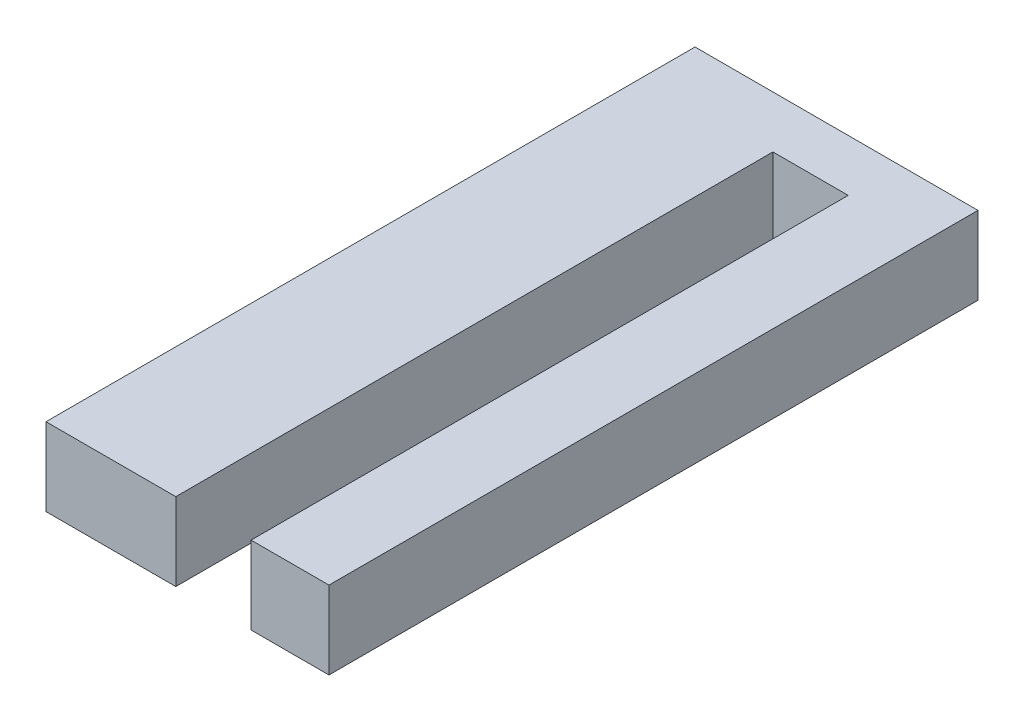
ISO-10303-21;
HEADER;
FILE_DESCRIPTION(('STEP AP214'),'2;1');
FILE_NAME('part.step','',(''),(''),'','','');
FILE_SCHEMA(('AUTOMOTIVE_DESIGN { 1 0 10303 214 1 1 1 1 }'));
ENDSEC;
DATA;
#1=APPLICATION_CONTEXT('core data for automotive mechanical design processes');
#2=APPLICATION_PROTOCOL_DEFINITION('international standard','automotive_design',2000,#1);
#3=PRODUCT_CONTEXT('',#1,'mechanical');
#4=PRODUCT('Part','Part','',(#3));
#5=PRODUCT_RELATED_PRODUCT_CATEGORY('part','',(#4));
#6=PRODUCT_DEFINITION_FORMATION('','',#4);
#7=PRODUCT_DEFINITION_CONTEXT('part definition',#1,'design');
#8=PRODUCT_DEFINITION('design','',#6,#7);
#9=PRODUCT_DEFINITION_SHAPE('','',#8);
#10=(LENGTH_UNIT() NAMED_UNIT(*) SI_UNIT(.MILLI.,.METRE.));
#11=(NAMED_UNIT(*) PLANE_ANGLE_UNIT() SI_UNIT($,.RADIAN.));
#12=(NAMED_UNIT(*) SI_UNIT($,.STERADIAN.) SOLID_ANGLE_UNIT());
#13=UNCERTAINTY_MEASURE_WITH_UNIT(LENGTH_MEASURE(1.E-05),#10,'distance_accuracy_value','');
#14=(GEOMETRIC_REPRESENTATION_CONTEXT(3) GLOBAL_UNCERTAINTY_ASSIGNED_CONTEXT((#13)) GLOBAL_UNIT_ASSIGNED_CONTEXT((#10,
#11,#12)) REPRESENTATION_CONTEXT('',''));
#15=CARTESIAN_POINT('',(0.,0.,0.));
#16=DIRECTION('',(0.,0.,1.));
#17=DIRECTION('',(1.,0.,0.));
#18=AXIS2_PLACEMENT_3D('',#15,#16,#17);
#19=CARTESIAN_POINT('',(5.,3.,0.));
#20=DIRECTION('',(0.,0.,-1.));
#21=DIRECTION('',(-1.,0.,0.));
#22=AXIS2_PLACEMENT_3D('',#19,#20,#21);
#23=PLANE('',#22);
#24=DIRECTION('',(1.,0.,0.));
#25=VECTOR('',#24,1.);
#26=CARTESIAN_POINT('',(5.,0.,0.));
#27=LINE('',#26,#25);
#28=CARTESIAN_POINT('',(0.,0.,0.));
#29=VERTEX_POINT('',#28);
#30=CARTESIAN_POINT('',(5.,0.,0.));
#31=VERTEX_POINT('',#30);
#32=EDGE_CURVE('E135',#29,#31,#27,.T.);
#33=ORIENTED_EDGE('',*,*,#32,.T.);
#34=DIRECTION('',(0.,-1.,0.));
#35=VECTOR('',#34,1.);
#36=CARTESIAN_POINT('',(5.,3.,0.));
#37=LINE('',#36,#35);
#38=CARTESIAN_POINT('',(5.,3.,0.));
#39=VERTEX_POINT('',#38);
#40=EDGE_CURVE('E11',#39,#31,#37,.T.);
#41=ORIENTED_EDGE('',*,*,#40,.F.);
#42=DIRECTION('',(1.,0.,0.));
#43=VECTOR('',#42,1.);
#44=CARTESIAN_POINT('',(5.,3.,0.));
#45=LINE('',#44,#43);
#46=CARTESIAN_POINT('',(0.,3.,0.));
#47=VERTEX_POINT('',#46);
#48=EDGE_CURVE('E149',#47,#39,#45,.T.);
#49=ORIENTED_EDGE('',*,*,#48,.F.);
#50=DIRECTION('',(0.,-1.,0.));
#51=VECTOR('',#50,1.);
#52=CARTESIAN_POINT('',(0.,3.,0.));
#53=LINE('',#52,#51);
#54=EDGE_CURVE('E131',#47,#29,#53,.T.);
#55=ORIENTED_EDGE('',*,*,#54,.T.);
#56=EDGE_LOOP('',(#33,#41,#49,#55));
#57=FACE_BOUND('',#56,.T.);
#58=ADVANCED_FACE('F39',(#57),#23,.F.);
#59=CARTESIAN_POINT('',(5.,3.,-23.));
#60=DIRECTION('',(-1.,0.,0.));
#61=DIRECTION('',(0.,0.,1.));
#62=AXIS2_PLACEMENT_3D('',#59,#60,#61);
#63=PLANE('',#62);
#64=DIRECTION('',(0.,0.,-1.));
#65=VECTOR('',#64,1.);
#66=CARTESIAN_POINT('',(5.,0.,-23.));
#67=LINE('',#66,#65);
#68=CARTESIAN_POINT('',(5.,0.,-23.));
#69=VERTEX_POINT('',#68);
#70=EDGE_CURVE('E138',#31,#69,#67,.T.);
#71=ORIENTED_EDGE('',*,*,#70,.T.);
#72=DIRECTION('',(0.,-1.,0.));
#73=VECTOR('',#72,1.);
#74=CARTESIAN_POINT('',(5.,3.,-23.));
#75=LINE('',#74,#73);
#76=CARTESIAN_POINT('',(5.,3.,-23.));
#77=VERTEX_POINT('',#76);
#78=EDGE_CURVE('E47',#77,#69,#75,.T.);
#79=ORIENTED_EDGE('',*,*,#78,.F.);
#80=DIRECTION('',(0.,0.,-1.));
#81=VECTOR('',#80,1.);
#82=CARTESIAN_POINT('',(5.,3.,-23.));
#83=LINE('',#82,#81);
#84=EDGE_CURVE('E98',#39,#77,#83,.T.);
#85=ORIENTED_EDGE('',*,*,#84,.F.);
#86=ORIENTED_EDGE('',*,*,#40,.T.);
#87=EDGE_LOOP('',(#71,#79,#85,#86));
#88=FACE_BOUND('',#87,.T.);
#89=ADVANCED_FACE('F184',(#88),#63,.F.);
#90=CARTESIAN_POINT('',(7.9,3.,-23.));
#91=DIRECTION('',(0.,0.,-1.));
#92=DIRECTION('',(-1.,0.,0.));
#93=AXIS2_PLACEMENT_3D('',#90,#91,#92);
#94=PLANE('',#93);
#95=DIRECTION('',(1.,0.,0.));
#96=VECTOR('',#95,1.);
#97=CARTESIAN_POINT('',(7.9,0.,-23.));
#98=LINE('',#97,#96);
#99=CARTESIAN_POINT('',(7.9,0.,-23.));
#100=VERTEX_POINT('',#99);
#101=EDGE_CURVE('E140',#69,#100,#98,.T.);
#102=ORIENTED_EDGE('',*,*,#101,.T.);
#103=DIRECTION('',(0.,-1.,0.));
#104=VECTOR('',#103,1.);
#105=CARTESIAN_POINT('',(7.9,3.,-23.));
#106=LINE('',#105,#104);
#107=CARTESIAN_POINT('',(7.9,3.,-23.));
#108=VERTEX_POINT('',#107);
#109=EDGE_CURVE('E156',#108,#100,#106,.T.);
#110=ORIENTED_EDGE('',*,*,#109,.F.);
#111=DIRECTION('',(1.,0.,0.));
#112=VECTOR('',#111,1.);
#113=CARTESIAN_POINT('',(7.9,3.,-23.));
#114=LINE('',#113,#112);
#115=EDGE_CURVE('E164',#77,#108,#114,.T.);
#116=ORIENTED_EDGE('',*,*,#115,.F.);
#117=ORIENTED_EDGE('',*,*,#78,.T.);
#118=EDGE_LOOP('',(#102,#110,#116,#117));
#119=FACE_BOUND('',#118,.T.);
#120=ADVANCED_FACE('F162',(#119),#94,.F.);
#121=CARTESIAN_POINT('',(7.9,3.,0.));
#122=DIRECTION('',(1.,0.,0.));
#123=DIRECTION('',(0.,0.,-1.));
#124=AXIS2_PLACEMENT_3D('',#121,#122,#123);
#125=PLANE('',#124);
#126=DIRECTION('',(0.,0.,1.));
#127=VECTOR('',#126,1.);
#128=CARTESIAN_POINT('',(7.9,0.,0.));
#129=LINE('',#128,#127);
#130=CARTESIAN_POINT('',(7.9,0.,0.));
#131=VERTEX_POINT('',#130);
#132=EDGE_CURVE('E142',#100,#131,#129,.T.);
#133=ORIENTED_EDGE('',*,*,#132,.T.);
#134=DIRECTION('',(0.,-1.,0.));
#135=VECTOR('',#134,1.);
#136=CARTESIAN_POINT('',(7.9,3.,0.));
#137=LINE('',#136,#135);
#138=CARTESIAN_POINT('',(7.9,3.,0.));
#139=VERTEX_POINT('',#138);
#140=EDGE_CURVE('E153',#139,#131,#137,.T.);
#141=ORIENTED_EDGE('',*,*,#140,.F.);
#142=DIRECTION('',(0.,0.,1.));
#143=VECTOR('',#142,1.);
#144=CARTESIAN_POINT('',(7.9,3.,0.));
#145=LINE('',#144,#143);
#146=EDGE_CURVE('E176',#108,#139,#145,.T.);
#147=ORIENTED_EDGE('',*,*,#146,.F.);
#148=ORIENTED_EDGE('',*,*,#109,.T.);
#149=EDGE_LOOP('',(#133,#141,#147,#148));
#150=FACE_BOUND('',#149,.T.);
#151=ADVANCED_FACE('F172',(#150),#125,.F.);
#152=CARTESIAN_POINT('',(10.9,3.,0.));
#153=DIRECTION('',(0.,0.,-1.));
#154=DIRECTION('',(-1.,0.,0.));
#155=AXIS2_PLACEMENT_3D('',#152,#153,#154);
#156=PLANE('',#155);
#157=DIRECTION('',(1.,0.,0.));
#158=VECTOR('',#157,1.);
#159=CARTESIAN_POINT('',(10.9,0.,0.));
#160=LINE('',#159,#158);
#161=CARTESIAN_POINT('',(10.9,0.,0.));
#162=VERTEX_POINT('',#161);
#163=EDGE_CURVE('E144',#131,#162,#160,.T.);
#164=ORIENTED_EDGE('',*,*,#163,.T.);
#165=DIRECTION('',(0.,-1.,0.));
#166=VECTOR('',#165,1.);
#167=CARTESIAN_POINT('',(10.9,3.,0.));
#168=LINE('',#167,#166);
#169=CARTESIAN_POINT('',(10.9,3.,0.));
#170=VERTEX_POINT('',#169);
#171=EDGE_CURVE('E126',#170,#162,#168,.T.);
#172=ORIENTED_EDGE('',*,*,#171,.F.);
#173=DIRECTION('',(1.,0.,0.));
#174=VECTOR('',#173,1.);
#175=CARTESIAN_POINT('',(10.9,3.,0.));
#176=LINE('',#175,#174);
#177=EDGE_CURVE('E117',#139,#170,#176,.T.);
#178=ORIENTED_EDGE('',*,*,#177,.F.);
#179=ORIENTED_EDGE('',*,*,#140,.T.);
#180=EDGE_LOOP('',(#164,#172,#178,#179));
#181=FACE_BOUND('',#180,.T.);
#182=ADVANCED_FACE('F175',(#181),#156,.F.);
#183=CARTESIAN_POINT('',(10.9,3.,-25.));
#184=DIRECTION('',(-1.,0.,0.));
#185=DIRECTION('',(0.,0.,1.));
#186=AXIS2_PLACEMENT_3D('',#183,#184,#185);
#187=PLANE('',#186);
#188=DIRECTION('',(0.,0.,-1.));
#189=VECTOR('',#188,1.);
#190=CARTESIAN_POINT('',(10.9,0.,-25.));
#191=LINE('',#190,#189);
#192=CARTESIAN_POINT('',(10.9,0.,-25.));
#193=VERTEX_POINT('',#192);
#194=EDGE_CURVE('E125',#162,#193,#191,.T.);
#195=ORIENTED_EDGE('',*,*,#194,.T.);
#196=DIRECTION('',(0.,-1.,0.));
#197=VECTOR('',#196,1.);
#198=CARTESIAN_POINT('',(10.9,3.,-25.));
#199=LINE('',#198,#197);
#200=CARTESIAN_POINT('',(10.9,3.,-25.));
#201=VERTEX_POINT('',#200);
#202=EDGE_CURVE('E122',#201,#193,#199,.T.);
#203=ORIENTED_EDGE('',*,*,#202,.F.);
#204=DIRECTION('',(0.,0.,-1.));
#205=VECTOR('',#204,1.);
#206=CARTESIAN_POINT('',(10.9,3.,-25.));
#207=LINE('',#206,#205);
#208=EDGE_CURVE('E111',#170,#201,#207,.T.);
#209=ORIENTED_EDGE('',*,*,#208,.F.);
#210=ORIENTED_EDGE('',*,*,#171,.T.);
#211=EDGE_LOOP('',(#195,#203,#209,#210));
#212=FACE_BOUND('',#211,.T.);
#213=ADVANCED_FACE('F123',(#212),#187,.F.);
#214=CARTESIAN_POINT('',(0.,3.,-25.));
#215=DIRECTION('',(0.,0.,1.));
#216=DIRECTION('',(1.,0.,0.));
#217=AXIS2_PLACEMENT_3D('',#214,#215,#216);
#218=PLANE('',#217);
#219=DIRECTION('',(-1.,0.,0.));
#220=VECTOR('',#219,1.);
#221=CARTESIAN_POINT('',(0.,0.,-25.));
#222=LINE('',#221,#220);
#223=CARTESIAN_POINT('',(0.,0.,-25.));
#224=VERTEX_POINT('',#223);
#225=EDGE_CURVE('E84',#193,#224,#222,.T.);
#226=ORIENTED_EDGE('',*,*,#225,.T.);
#227=DIRECTION('',(0.,-1.,0.));
#228=VECTOR('',#227,1.);
#229=CARTESIAN_POINT('',(0.,3.,-25.));
#230=LINE('',#229,#228);
#231=CARTESIAN_POINT('',(0.,3.,-25.));
#232=VERTEX_POINT('',#231);
#233=EDGE_CURVE('E127',#232,#224,#230,.T.);
#234=ORIENTED_EDGE('',*,*,#233,.F.);
#235=DIRECTION('',(-1.,0.,0.));
#236=VECTOR('',#235,1.);
#237=CARTESIAN_POINT('',(0.,3.,-25.));
#238=LINE('',#237,#236);
#239=EDGE_CURVE('E115',#201,#232,#238,.T.);
#240=ORIENTED_EDGE('',*,*,#239,.F.);
#241=ORIENTED_EDGE('',*,*,#202,.T.);
#242=EDGE_LOOP('',(#226,#234,#240,#241));
#243=FACE_BOUND('',#242,.T.);
#244=ADVANCED_FACE('F129',(#243),#218,.F.);
#245=CARTESIAN_POINT('',(0.,3.,0.));
#246=DIRECTION('',(1.,0.,0.));
#247=DIRECTION('',(0.,0.,-1.));
#248=AXIS2_PLACEMENT_3D('',#245,#246,#247);
#249=PLANE('',#248);
#250=DIRECTION('',(0.,0.,1.));
#251=VECTOR('',#250,1.);
#252=CARTESIAN_POINT('',(0.,0.,0.));
#253=LINE('',#252,#251);
#254=EDGE_CURVE('E90',#224,#29,#253,.T.);
#255=ORIENTED_EDGE('',*,*,#254,.T.);
#256=ORIENTED_EDGE('',*,*,#54,.F.);
#257=DIRECTION('',(0.,0.,1.));
#258=VECTOR('',#257,1.);
#259=CARTESIAN_POINT('',(0.,3.,0.));
#260=LINE('',#259,#258);
#261=EDGE_CURVE('E55',#232,#47,#260,.T.);
#262=ORIENTED_EDGE('',*,*,#261,.F.);
#263=ORIENTED_EDGE('',*,*,#233,.T.);
#264=EDGE_LOOP('',(#255,#256,#262,#263));
#265=FACE_BOUND('',#264,.T.);
#266=ADVANCED_FACE('F200',(#265),#249,.F.);
#267=CARTESIAN_POINT('',(0.,3.,0.));
#268=DIRECTION('',(0.,-1.,0.));
#269=DIRECTION('',(0.,0.,-1.));
#270=AXIS2_PLACEMENT_3D('',#267,#268,#269);
#271=PLANE('',#270);
#272=ORIENTED_EDGE('',*,*,#48,.T.);
#273=ORIENTED_EDGE('',*,*,#84,.T.);
#274=ORIENTED_EDGE('',*,*,#115,.T.);
#275=ORIENTED_EDGE('',*,*,#146,.T.);
#276=ORIENTED_EDGE('',*,*,#177,.T.);
#277=ORIENTED_EDGE('',*,*,#208,.T.);
#278=ORIENTED_EDGE('',*,*,#239,.T.);
#279=ORIENTED_EDGE('',*,*,#261,.T.);
#280=EDGE_LOOP('',(#272,#273,#274,#275,#276,#277,#278,#279));
#281=FACE_BOUND('',#280,.T.);
#282=ADVANCED_FACE('F113',(#281),#271,.F.);
#283=CARTESIAN_POINT('',(0.,0.,0.));
#284=DIRECTION('',(0.,-1.,0.));
#285=DIRECTION('',(0.,0.,-1.));
#286=AXIS2_PLACEMENT_3D('',#283,#284,#285);
#287=PLANE('',#286);
#288=ORIENTED_EDGE('',*,*,#32,.F.);
#289=ORIENTED_EDGE('',*,*,#254,.F.);
#290=ORIENTED_EDGE('',*,*,#225,.F.);
#291=ORIENTED_EDGE('',*,*,#194,.F.);
#292=ORIENTED_EDGE('',*,*,#163,.F.);
#293=ORIENTED_EDGE('',*,*,#132,.F.);
#294=ORIENTED_EDGE('',*,*,#101,.F.);
#295=ORIENTED_EDGE('',*,*,#70,.F.);
#296=EDGE_LOOP('',(#288,#289,#290,#291,#292,#293,#294,#295));
#297=FACE_BOUND('',#296,.T.);
#298=ADVANCED_FACE('F168',(#297),#287,.T.);
#299=CLOSED_SHELL('',(#58,#89,#120,#151,#182,#213,#244,#266,#282,#298));
#300=MANIFOLD_SOLID_BREP('B2',#299);
#301=ADVANCED_BREP_SHAPE_REPRESENTATION('',(#18,#300),#14);
#302=SHAPE_DEFINITION_REPRESENTATION(#9,#301);
ENDSEC;
END-ISO-10303-21;
